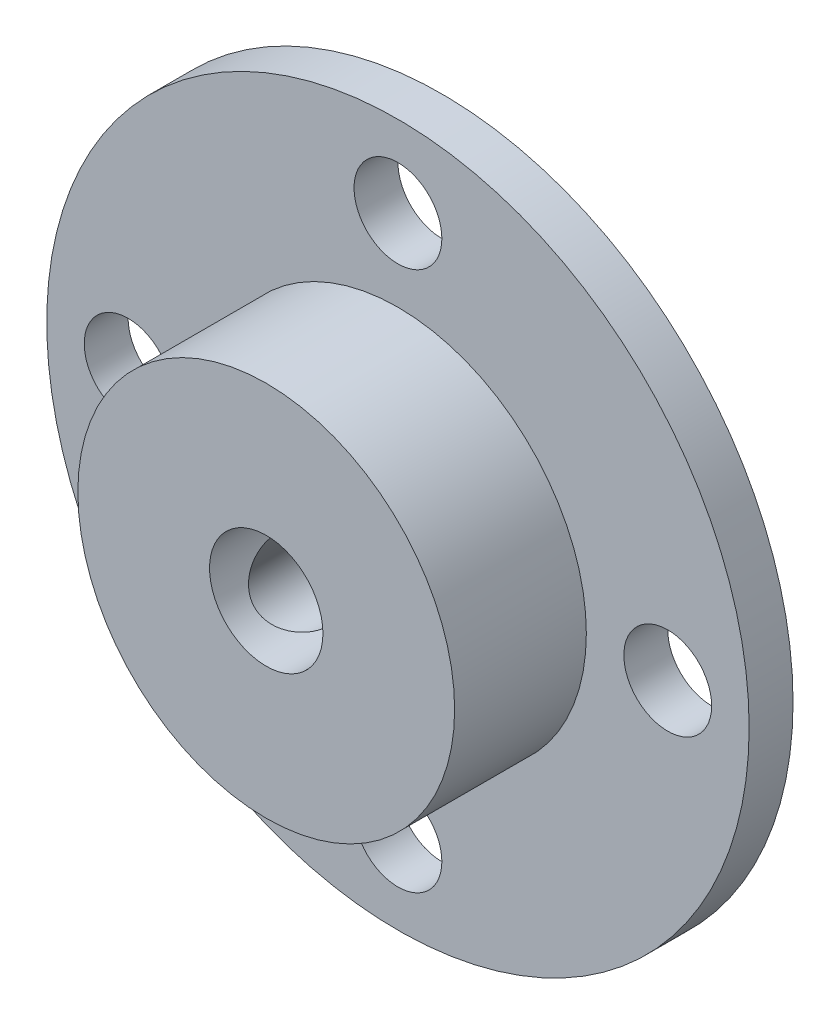
ISO-10303-21;
HEADER;
FILE_DESCRIPTION(('STEP AP214'),'2;1');
FILE_NAME('part.step','',(''),(''),'','','');
FILE_SCHEMA(('AUTOMOTIVE_DESIGN { 1 0 10303 214 1 1 1 1 }'));
ENDSEC;
DATA;
#1=APPLICATION_CONTEXT('core data for automotive mechanical design processes');
#2=APPLICATION_PROTOCOL_DEFINITION('international standard','automotive_design',2000,#1);
#3=PRODUCT_CONTEXT('',#1,'mechanical');
#4=PRODUCT('Part','Part','',(#3));
#5=PRODUCT_RELATED_PRODUCT_CATEGORY('part','',(#4));
#6=PRODUCT_DEFINITION_FORMATION('','',#4);
#7=PRODUCT_DEFINITION_CONTEXT('part definition',#1,'design');
#8=PRODUCT_DEFINITION('design','',#6,#7);
#9=PRODUCT_DEFINITION_SHAPE('','',#8);
#10=(LENGTH_UNIT() NAMED_UNIT(*) SI_UNIT(.MILLI.,.METRE.));
#11=(NAMED_UNIT(*) PLANE_ANGLE_UNIT() SI_UNIT($,.RADIAN.));
#12=(NAMED_UNIT(*) SI_UNIT($,.STERADIAN.) SOLID_ANGLE_UNIT());
#13=UNCERTAINTY_MEASURE_WITH_UNIT(LENGTH_MEASURE(1.E-05),#10,'distance_accuracy_value','');
#14=(GEOMETRIC_REPRESENTATION_CONTEXT(3) GLOBAL_UNCERTAINTY_ASSIGNED_CONTEXT((#13)) GLOBAL_UNIT_ASSIGNED_CONTEXT((#10,
#11,#12)) REPRESENTATION_CONTEXT('',''));
#15=CARTESIAN_POINT('',(0.,0.,0.));
#16=DIRECTION('',(0.,0.,1.));
#17=DIRECTION('',(1.,0.,0.));
#18=AXIS2_PLACEMENT_3D('',#15,#16,#17);
#19=CARTESIAN_POINT('',(15.304322218472,0.,9.08050000000009));
#20=DIRECTION('',(0.,0.,-1.));
#21=DIRECTION('',(-1.,0.,0.));
#22=AXIS2_PLACEMENT_3D('',#19,#20,#21);
#23=PLANE('',#22);
#24=CARTESIAN_POINT('',(15.304322218472,14.947217801772,9.08050000000009));
#25=DIRECTION('',(0.,0.,1.));
#26=DIRECTION('',(1.,0.,0.));
#27=AXIS2_PLACEMENT_3D('',#24,#25,#26);
#28=CIRCLE('',#27,1.58749999999999);
#29=CARTESIAN_POINT('',(16.891822218472,14.947217801772,9.08050000000009));
#30=VERTEX_POINT('',#29);
#31=EDGE_CURVE('E90',#30,#30,#28,.T.);
#32=ORIENTED_EDGE('',*,*,#31,.F.);
#33=EDGE_LOOP('',(#32));
#34=FACE_BOUND('',#33,.T.);
#35=CARTESIAN_POINT('',(25.060572218472,24.703467801772,9.08050000000009));
#36=DIRECTION('',(0.,0.,1.));
#37=DIRECTION('',(1.,0.,0.));
#38=AXIS2_PLACEMENT_3D('',#35,#36,#37);
#39=CIRCLE('',#38,1.58749999999999);
#40=CARTESIAN_POINT('',(26.648072218472,24.703467801772,9.08050000000009));
#41=VERTEX_POINT('',#40);
#42=EDGE_CURVE('E84',#41,#41,#39,.T.);
#43=ORIENTED_EDGE('',*,*,#42,.F.);
#44=EDGE_LOOP('',(#43));
#45=FACE_BOUND('',#44,.T.);
#46=CARTESIAN_POINT('',(15.304322218472,34.459717801772,9.08050000000009));
#47=DIRECTION('',(0.,0.,1.));
#48=DIRECTION('',(1.,0.,0.));
#49=AXIS2_PLACEMENT_3D('',#46,#47,#48);
#50=CIRCLE('',#49,1.58749999999999);
#51=CARTESIAN_POINT('',(16.891822218472,34.459717801772,9.08050000000009));
#52=VERTEX_POINT('',#51);
#53=EDGE_CURVE('E78',#52,#52,#50,.T.);
#54=ORIENTED_EDGE('',*,*,#53,.F.);
#55=EDGE_LOOP('',(#54));
#56=FACE_BOUND('',#55,.T.);
#57=CARTESIAN_POINT('',(15.304322218472,24.703467801772,9.08050000000009));
#58=DIRECTION('',(0.,0.,1.));
#59=DIRECTION('',(1.,0.,0.));
#60=AXIS2_PLACEMENT_3D('',#57,#58,#59);
#61=CIRCLE('',#60,6.81250000000001);
#62=CARTESIAN_POINT('',(22.116822218472,24.703467801772,9.08050000000009));
#63=VERTEX_POINT('',#62);
#64=EDGE_CURVE('E60',#63,#63,#61,.T.);
#65=ORIENTED_EDGE('',*,*,#64,.F.);
#66=EDGE_LOOP('',(#65));
#67=FACE_BOUND('',#66,.T.);
#68=CARTESIAN_POINT('',(15.304322218472,24.703467801772,9.08050000000009));
#69=DIRECTION('',(0.,0.,1.));
#70=DIRECTION('',(1.,0.,0.));
#71=AXIS2_PLACEMENT_3D('',#68,#69,#70);
#72=CIRCLE('',#71,12.7);
#73=CARTESIAN_POINT('',(28.004322218472,24.703467801772,9.08050000000009));
#74=VERTEX_POINT('',#73);
#75=EDGE_CURVE('E63',#74,#74,#72,.T.);
#76=ORIENTED_EDGE('',*,*,#75,.T.);
#77=EDGE_LOOP('',(#76));
#78=FACE_BOUND('',#77,.T.);
#79=CARTESIAN_POINT('',(5.54807221847201,24.703467801772,9.08050000000009));
#80=DIRECTION('',(0.,0.,1.));
#81=DIRECTION('',(1.,0.,0.));
#82=AXIS2_PLACEMENT_3D('',#79,#80,#81);
#83=CIRCLE('',#82,1.58749999999999);
#84=CARTESIAN_POINT('',(7.135572218472,24.703467801772,9.08050000000009));
#85=VERTEX_POINT('',#84);
#86=EDGE_CURVE('E72',#85,#85,#83,.T.);
#87=ORIENTED_EDGE('',*,*,#86,.F.);
#88=EDGE_LOOP('',(#87));
#89=FACE_BOUND('',#88,.T.);
#90=ADVANCED_FACE('F39',(#34,#45,#56,#67,#78,#89),#23,.F.);
#91=CARTESIAN_POINT('',(15.304322218472,0.,7.49300000000009));
#92=DIRECTION('',(0.,0.,1.));
#93=DIRECTION('',(1.,0.,0.));
#94=AXIS2_PLACEMENT_3D('',#91,#92,#93);
#95=PLANE('',#94);
#96=CARTESIAN_POINT('',(15.304322218472,14.947217801772,7.49300000000009));
#97=DIRECTION('',(0.,0.,1.));
#98=DIRECTION('',(1.,0.,0.));
#99=AXIS2_PLACEMENT_3D('',#96,#97,#98);
#100=CIRCLE('',#99,1.5875);
#101=CARTESIAN_POINT('',(16.891822218472,14.947217801772,7.49300000000009));
#102=VERTEX_POINT('',#101);
#103=EDGE_CURVE('E87',#102,#102,#100,.T.);
#104=ORIENTED_EDGE('',*,*,#103,.T.);
#105=EDGE_LOOP('',(#104));
#106=FACE_BOUND('',#105,.T.);
#107=CARTESIAN_POINT('',(25.060572218472,24.703467801772,7.49300000000009));
#108=DIRECTION('',(0.,0.,1.));
#109=DIRECTION('',(1.,0.,0.));
#110=AXIS2_PLACEMENT_3D('',#107,#108,#109);
#111=CIRCLE('',#110,1.5875);
#112=CARTESIAN_POINT('',(26.648072218472,24.703467801772,7.49300000000009));
#113=VERTEX_POINT('',#112);
#114=EDGE_CURVE('E81',#113,#113,#111,.T.);
#115=ORIENTED_EDGE('',*,*,#114,.T.);
#116=EDGE_LOOP('',(#115));
#117=FACE_BOUND('',#116,.T.);
#118=CARTESIAN_POINT('',(15.304322218472,34.459717801772,7.49300000000009));
#119=DIRECTION('',(0.,0.,1.));
#120=DIRECTION('',(1.,0.,0.));
#121=AXIS2_PLACEMENT_3D('',#118,#119,#120);
#122=CIRCLE('',#121,1.5875);
#123=CARTESIAN_POINT('',(16.891822218472,34.459717801772,7.49300000000009));
#124=VERTEX_POINT('',#123);
#125=EDGE_CURVE('E75',#124,#124,#122,.T.);
#126=ORIENTED_EDGE('',*,*,#125,.T.);
#127=EDGE_LOOP('',(#126));
#128=FACE_BOUND('',#127,.T.);
#129=CARTESIAN_POINT('',(5.54807221847201,24.703467801772,7.49300000000009));
#130=DIRECTION('',(0.,0.,1.));
#131=DIRECTION('',(1.,0.,0.));
#132=AXIS2_PLACEMENT_3D('',#129,#130,#131);
#133=CIRCLE('',#132,1.5875);
#134=CARTESIAN_POINT('',(7.13557221847201,24.703467801772,7.49300000000009));
#135=VERTEX_POINT('',#134);
#136=EDGE_CURVE('E69',#135,#135,#133,.T.);
#137=ORIENTED_EDGE('',*,*,#136,.T.);
#138=EDGE_LOOP('',(#137));
#139=FACE_BOUND('',#138,.T.);
#140=CARTESIAN_POINT('',(15.304322218472,24.703467801772,7.49300000000009));
#141=DIRECTION('',(0.,0.,1.));
#142=DIRECTION('',(1.,0.,0.));
#143=AXIS2_PLACEMENT_3D('',#140,#141,#142);
#144=CIRCLE('',#143,12.7);
#145=CARTESIAN_POINT('',(28.004322218472,24.703467801772,7.49300000000009));
#146=VERTEX_POINT('',#145);
#147=EDGE_CURVE('E66',#146,#146,#144,.T.);
#148=ORIENTED_EDGE('',*,*,#147,.F.);
#149=EDGE_LOOP('',(#148));
#150=FACE_BOUND('',#149,.T.);
#151=CARTESIAN_POINT('',(15.304322218472,24.703467801772,7.49300000000009));
#152=DIRECTION('',(0.,0.,1.));
#153=DIRECTION('',(1.,0.,0.));
#154=AXIS2_PLACEMENT_3D('',#151,#152,#153);
#155=CIRCLE('',#154,2.05);
#156=CARTESIAN_POINT('',(17.354322218472,24.703467801772,7.49300000000009));
#157=VERTEX_POINT('',#156);
#158=EDGE_CURVE('E10',#157,#157,#155,.T.);
#159=ORIENTED_EDGE('',*,*,#158,.T.);
#160=EDGE_LOOP('',(#159));
#161=FACE_BOUND('',#160,.T.);
#162=ADVANCED_FACE('F41',(#106,#117,#128,#139,#150,#161),#95,.F.);
#163=CARTESIAN_POINT('',(15.304322218472,24.703467801772,13.843));
#164=DIRECTION('',(0.,0.,1.));
#165=DIRECTION('',(1.,0.,0.));
#166=AXIS2_PLACEMENT_3D('',#163,#164,#165);
#167=CYLINDRICAL_SURFACE('',#166,2.05);
#168=CARTESIAN_POINT('',(15.1714287863492,22.6577798158614,11.46175));
#169=CARTESIAN_POINT('',(15.1714199645603,22.6577774869909,11.3955140145172));
#170=CARTESIAN_POINT('',(15.1648818997962,22.6581731530945,11.3292467675641));
#171=CARTESIAN_POINT('',(15.1396058342408,22.6600598870282,11.1990667024952));
#172=CARTESIAN_POINT('',(15.1208459232602,22.6615529227378,11.1351583309857));
#173=CARTESIAN_POINT('',(15.0734362721785,22.6663749447985,11.0119700058423));
#174=CARTESIAN_POINT('',(15.0448802410607,22.6696867074661,10.9526524980655));
#175=CARTESIAN_POINT('',(14.9799808208232,22.6790230558176,10.838729667946));
#176=CARTESIAN_POINT('',(14.9436357257995,22.6850482360932,10.7841253815395));
#177=CARTESIAN_POINT('',(14.8589640870089,22.7018962780591,10.6720885472307));
#178=CARTESIAN_POINT('',(14.8096561798401,22.7133088655971,10.6154862149188));
#179=CARTESIAN_POINT('',(14.7052471223705,22.742205430255,10.5095705609515));
#180=CARTESIAN_POINT('',(14.6501405193552,22.7596951581381,10.4602642066784));
#181=CARTESIAN_POINT('',(14.5280277077454,22.8048701846117,10.3634623122151));
#182=CARTESIAN_POINT('',(14.4604366044041,22.8336414988397,10.3171909256965));
#183=CARTESIAN_POINT('',(14.3232301576745,22.9018561669057,10.2371619056692));
#184=CARTESIAN_POINT('',(14.2536171191645,22.9412877643306,10.20339058342));
#185=CARTESIAN_POINT('',(14.1234619621062,23.0261423248724,10.1533811500106));
#186=CARTESIAN_POINT('',(14.0627670321254,23.0704228617283,10.1356187215504));
#187=CARTESIAN_POINT('',(13.9453320279352,23.1667866019915,10.1128891876442));
#188=CARTESIAN_POINT('',(13.8885872013698,23.2188601833073,10.107906438811));
#189=CARTESIAN_POINT('',(13.789546760068,23.3206318017379,10.1108378240011));
#190=CARTESIAN_POINT('',(13.7463581033761,23.3695271825575,10.116940487124));
#191=CARTESIAN_POINT('',(13.6656983961584,23.4699533467321,10.1382900493217));
#192=CARTESIAN_POINT('',(13.6282277669137,23.5214843238941,10.1535376217491));
#193=CARTESIAN_POINT('',(13.5596179744598,23.6253326367168,10.1923710761501));
#194=CARTESIAN_POINT('',(13.5284615488111,23.6776473967091,10.2159337278014));
#195=CARTESIAN_POINT('',(13.4723069383115,23.7816662895443,10.2704892760165));
#196=CARTESIAN_POINT('',(13.4473099192479,23.8333703050315,10.3014835769776));
#197=CARTESIAN_POINT('',(13.4001860059442,23.9414459512927,10.374518041243));
#198=CARTESIAN_POINT('',(13.3788582452279,23.9975472285777,10.4174714948528));
#199=CARTESIAN_POINT('',(13.3426256386925,24.1055544664628,10.510839853361));
#200=CARTESIAN_POINT('',(13.3277307960009,24.1574537919832,10.561266216213));
#201=CARTESIAN_POINT('',(13.3014537418999,24.2625903413061,10.677020517984));
#202=CARTESIAN_POINT('',(13.2909433147047,24.3148430811856,10.743448749122));
#203=CARTESIAN_POINT('',(13.2751970268864,24.4078698784059,10.88446685245));
#204=CARTESIAN_POINT('',(13.2699520669274,24.4486636499734,10.9590423969083));
#205=CARTESIAN_POINT('',(13.2637944712764,24.5051829415229,11.0930485650476));
#206=CARTESIAN_POINT('',(13.2620774203889,24.5247333238865,11.150823425438));
#207=CARTESIAN_POINT('',(13.2597245546632,24.5539970509941,11.2688024604137));
#208=CARTESIAN_POINT('',(13.2590869305586,24.5637268453038,11.3290023964536));
#209=CARTESIAN_POINT('',(13.2585156851902,24.5723271498539,11.4504350359262));
#210=CARTESIAN_POINT('',(13.2585848491961,24.5711546987906,11.5116708752027));
#211=CARTESIAN_POINT('',(13.2594813940261,24.5579859561689,11.6329806152367));
#212=CARTESIAN_POINT('',(13.2603093996507,24.545980745467,11.6930535168515));
#213=CARTESIAN_POINT('',(13.2631131413159,24.5131572108651,11.8078562427013));
#214=CARTESIAN_POINT('',(13.2650381068975,24.492739136349,11.8627047275711));
#215=CARTESIAN_POINT('',(13.2705774134969,24.4446909255356,11.9690219271715));
#216=CARTESIAN_POINT('',(13.2741923148103,24.4170583986399,12.0204895145111));
#217=CARTESIAN_POINT('',(13.2846978754065,24.3499341778983,12.1295024062228));
#218=CARTESIAN_POINT('',(13.2920974400195,24.3091766998781,12.1862175708593));
#219=CARTESIAN_POINT('',(13.3113065949368,24.2213746589363,12.2937835040207));
#220=CARTESIAN_POINT('',(13.3231215689098,24.1743224660758,12.3446270138159));
#221=CARTESIAN_POINT('',(13.3551928440865,24.0653000917903,12.4498677927526));
#222=CARTESIAN_POINT('',(13.3766949825041,24.0022642320063,12.5027985282073));
#223=CARTESIAN_POINT('',(13.4291339834291,23.8721588867453,12.59795391872));
#224=CARTESIAN_POINT('',(13.4600618519544,23.8050932951823,12.6401887097546));
#225=CARTESIAN_POINT('',(13.5252718514823,23.6830299702917,12.7051210394376));
#226=CARTESIAN_POINT('',(13.5577243546258,23.628228730079,12.7300222677718));
#227=CARTESIAN_POINT('',(13.6294057440201,23.5196717583994,12.770663610797));
#228=CARTESIAN_POINT('',(13.6686289221308,23.4659151883389,12.7864113940146));
#229=CARTESIAN_POINT('',(13.7534604838814,23.3611236954304,12.8079590471889));
#230=CARTESIAN_POINT('',(13.7990944221165,23.310100853029,12.8137178084865));
#231=CARTESIAN_POINT('',(13.8953337513597,23.2128542426142,12.814797701582));
#232=CARTESIAN_POINT('',(13.9459389234631,23.1666302634707,12.8101192927764));
#233=CARTESIAN_POINT('',(14.0467934420968,23.0832460282611,12.7912839649766));
#234=CARTESIAN_POINT('',(14.0968387170379,23.0456856702497,12.7777842786922));
#235=CARTESIAN_POINT('',(14.1981020271379,22.9764640873092,12.7426287967657));
#236=CARTESIAN_POINT('',(14.2493202454708,22.9448037909219,12.7209717189446));
#237=CARTESIAN_POINT('',(14.3546577167087,22.8856354651859,12.6687514786015));
#238=CARTESIAN_POINT('',(14.4087567562866,22.858513985069,12.6377137236574));
#239=CARTESIAN_POINT('',(14.5150573442606,22.8105951450694,12.5683658363955));
#240=CARTESIAN_POINT('',(14.5672576372529,22.7898019046663,12.5300509931679));
#241=CARTESIAN_POINT('',(14.6762856902745,22.7510544559224,12.4404519428036));
#242=CARTESIAN_POINT('',(14.7325565905001,22.7340558682372,12.3880762357891));
#243=CARTESIAN_POINT('',(14.8385524523927,22.7063295582639,12.2755393392936));
#244=CARTESIAN_POINT('',(14.8882731753749,22.6956058812378,12.2153731579604));
#245=CARTESIAN_POINT('',(14.9742682022329,22.6797854582435,12.0939672845106));
#246=CARTESIAN_POINT('',(15.0113718880622,22.6742503042373,12.0333747762446));
#247=CARTESIAN_POINT('',(15.0756136646672,22.6660070501762,11.90697572615));
#248=CARTESIAN_POINT('',(15.102773059531,22.6632928833707,11.841180702259));
#249=CARTESIAN_POINT('',(15.1391337696063,22.6600742994613,11.7229967143598));
#250=CARTESIAN_POINT('',(15.1511520432815,22.659182141337,11.6714857826606));
#251=CARTESIAN_POINT('',(15.167300975507,22.6580359960182,11.5672394018041));
#252=CARTESIAN_POINT('',(15.1714358125916,22.6577816707243,11.51450461635));
#253=CARTESIAN_POINT('',(15.1714287863492,22.6577798158614,11.46175));
#254=B_SPLINE_CURVE_WITH_KNOTS('',3,(#168,#169,#170,#171,#172,#173,#174,#175,#176,#177,#178,
#179,#180,#181,#182,#183,#184,#185,#186,#187,#188,#189,#190,#191,#192,#193,#194,#195,#196,#197,
#198,#199,#200,#201,#202,#203,#204,#205,#206,#207,#208,#209,#210,#211,#212,#213,#214,#215,#216,
#217,#218,#219,#220,#221,#222,#223,#224,#225,#226,#227,#228,#229,#230,#231,#232,#233,#234,#235,
#236,#237,#238,#239,#240,#241,#242,#243,#244,#245,#246,#247,#248,#249,#250,#251,#252,#253),
.UNSPECIFIED.,.T.,.F.,(4,2,2,2,2,2,2,2,2,2,2,2,2,2,2,2,2,2,2,2,2,2,2,2,2,2,2,2,2,2,2,2,2,2,2,2,
2,2,2,2,2,2,4),(0.,0.19846766116353,0.39729209938491,0.594265314346897,0.791281713115574,
1.018223621449,1.24538087111949,1.50440168720251,1.76313800609326,1.99330313113167,
2.22318638021833,2.41880781196,2.61444364934988,2.8095371989191,3.00466764542153,
3.22523927669499,3.44615267058604,3.70047249061342,3.95435205612267,4.13667452357897,
4.31869109005059,4.50142521261421,4.68430992658484,4.85934754268071,5.03444323343903,
5.24440043184624,5.45461446886369,5.7086248931973,5.96239369697868,6.16668557686919,
6.37080605854312,6.57576459879228,6.78071411788431,6.97190826819848,7.16313248296466,
7.36638729862527,7.56977414498105,7.80503537530612,8.04044810543744,8.25345523527086,
8.46600332298344,8.62415963780598,8.78223210017279),.UNSPECIFIED.);
#255=CARTESIAN_POINT('',(15.1714287863492,22.6577798158614,11.46175));
#256=VERTEX_POINT('',#255);
#257=EDGE_CURVE('E43',#256,#256,#254,.T.);
#258=ORIENTED_EDGE('',*,*,#257,.F.);
#259=EDGE_LOOP('',(#258));
#260=FACE_BOUND('',#259,.T.);
#261=CARTESIAN_POINT('',(15.304322218472,24.703467801772,13.843));
#262=DIRECTION('',(0.,0.,1.));
#263=DIRECTION('',(1.,0.,0.));
#264=AXIS2_PLACEMENT_3D('',#261,#262,#263);
#265=CIRCLE('',#264,2.05);
#266=CARTESIAN_POINT('',(17.354322218472,24.703467801772,13.843));
#267=VERTEX_POINT('',#266);
#268=EDGE_CURVE('E51',#267,#267,#265,.T.);
#269=ORIENTED_EDGE('',*,*,#268,.T.);
#270=EDGE_LOOP('',(#269));
#271=FACE_BOUND('',#270,.T.);
#272=ORIENTED_EDGE('',*,*,#158,.F.);
#273=EDGE_LOOP('',(#272));
#274=FACE_BOUND('',#273,.T.);
#275=ADVANCED_FACE('F133',(#260,#271,#274),#167,.F.);
#276=CARTESIAN_POINT('',(15.304322218472,0.,13.843));
#277=DIRECTION('',(0.,0.,-1.));
#278=DIRECTION('',(-1.,0.,0.));
#279=AXIS2_PLACEMENT_3D('',#276,#277,#278);
#280=PLANE('',#279);
#281=ORIENTED_EDGE('',*,*,#268,.F.);
#282=EDGE_LOOP('',(#281));
#283=FACE_BOUND('',#282,.T.);
#284=CARTESIAN_POINT('',(15.304322218472,24.703467801772,13.843));
#285=DIRECTION('',(0.,0.,1.));
#286=DIRECTION('',(1.,0.,0.));
#287=AXIS2_PLACEMENT_3D('',#284,#285,#286);
#288=CIRCLE('',#287,6.81250000000001);
#289=CARTESIAN_POINT('',(22.116822218472,24.703467801772,13.843));
#290=VERTEX_POINT('',#289);
#291=EDGE_CURVE('E55',#290,#290,#288,.T.);
#292=ORIENTED_EDGE('',*,*,#291,.T.);
#293=EDGE_LOOP('',(#292));
#294=FACE_BOUND('',#293,.T.);
#295=ADVANCED_FACE('F152',(#283,#294),#280,.F.);
#296=CARTESIAN_POINT('',(15.304322218472,24.703467801772,13.843));
#297=DIRECTION('',(0.,0.,1.));
#298=DIRECTION('',(1.,0.,0.));
#299=AXIS2_PLACEMENT_3D('',#296,#297,#298);
#300=CYLINDRICAL_SURFACE('',#299,6.81250000000001);
#301=CARTESIAN_POINT('',(11.5394503467417,19.025801376254,11.46175));
#302=CARTESIAN_POINT('',(11.5394473185518,19.0258022963991,11.3865844068538));
#303=CARTESIAN_POINT('',(11.5340974460231,19.0293397378433,11.3113835245234));
#304=CARTESIAN_POINT('',(11.5129329798188,19.0434607625149,11.1631083166937));
#305=CARTESIAN_POINT('',(11.4971099523533,19.0540500244525,11.0900357546327));
#306=CARTESIAN_POINT('',(11.4557321285993,19.0821573286808,10.9481838342344));
#307=CARTESIAN_POINT('',(11.4301869383335,19.0996685323761,10.8794003159149));
#308=CARTESIAN_POINT('',(11.3704525761701,19.1414404500607,10.7479196310792));
#309=CARTESIAN_POINT('',(11.3362639096429,19.1657007694481,10.6852221090211));
#310=CARTESIAN_POINT('',(11.2601200292058,19.2210575714169,10.5668158833967));
#311=CARTESIAN_POINT('',(11.2180730676797,19.2522357223515,10.5112043461474));
#312=CARTESIAN_POINT('',(11.1280959329756,19.3208582418434,10.4093967709961));
#313=CARTESIAN_POINT('',(11.0801653509748,19.3583030459043,10.3632013879687));
#314=CARTESIAN_POINT('',(10.9797146084816,19.4392380838623,10.2811609627612));
#315=CARTESIAN_POINT('',(10.9271585835079,19.4827774516127,10.2454081697664));
#316=CARTESIAN_POINT('',(10.819668854331,19.5748188263087,10.1858629735031));
#317=CARTESIAN_POINT('',(10.7647353699358,19.6233203750391,10.1620694670937));
#318=CARTESIAN_POINT('',(10.655069655008,19.723503088888,10.1274204873493));
#319=CARTESIAN_POINT('',(10.6003440790509,19.7751347688734,10.116400970099));
#320=CARTESIAN_POINT('',(10.4921102736861,19.8807623627053,10.1071010433108));
#321=CARTESIAN_POINT('',(10.4386019290942,19.9347580514243,10.1088194233394));
#322=CARTESIAN_POINT('',(10.3350812273076,20.0427468890754,10.1248219246628));
#323=CARTESIAN_POINT('',(10.2850303448992,20.0967294381464,10.1389293525428));
#324=CARTESIAN_POINT('',(10.1888539586793,20.2037654754203,10.1790293272638));
#325=CARTESIAN_POINT('',(10.1427286103863,20.2568189267487,10.2050223447189));
#326=CARTESIAN_POINT('',(10.0551051336301,20.3605975799375,10.2683199028555));
#327=CARTESIAN_POINT('',(10.0136375904642,20.4113062363437,10.3056938367246));
#328=CARTESIAN_POINT('',(9.93638490352406,20.508321002359,10.3906409958362));
#329=CARTESIAN_POINT('',(9.90060040534107,20.5546266115447,10.4382153784044));
#330=CARTESIAN_POINT('',(9.83466298514698,20.6419368520022,10.5431828168706));
#331=CARTESIAN_POINT('',(9.8046173641969,20.6828367566108,10.6007305024064));
#332=CARTESIAN_POINT('',(9.75130454472971,20.7567937992976,10.7234991965261));
#333=CARTESIAN_POINT('',(9.72803747071949,20.7898507933168,10.7887203460237));
#334=CARTESIAN_POINT('',(9.68849358514529,20.8468066237487,10.9251979156615));
#335=CARTESIAN_POINT('',(9.67223144427483,20.8706862284527,10.9964666316214));
#336=CARTESIAN_POINT('',(9.64694134874401,20.9081136255437,11.1428932375894));
#337=CARTESIAN_POINT('',(9.63791246617348,20.9216627431544,11.2180506274261));
#338=CARTESIAN_POINT('',(9.62727170991614,20.9376550706237,11.3687631221788));
#339=CARTESIAN_POINT('',(9.6255373042373,20.9402817461403,11.4442901377136));
#340=CARTESIAN_POINT('',(9.6291671206785,20.9348100445299,11.5947794615247));
#341=CARTESIAN_POINT('',(9.63453094649933,20.9267122661565,11.6697418010923));
#342=CARTESIAN_POINT('',(9.65221686492891,20.9002970909013,11.816248494049));
#343=CARTESIAN_POINT('',(9.6644728864165,20.882076752333,11.887818406694));
#344=CARTESIAN_POINT('',(9.69577307918782,20.8362857172513,12.0263317807406));
#345=CARTESIAN_POINT('',(9.71481780270935,20.8087142600652,12.0932748652364));
#346=CARTESIAN_POINT('',(9.75979261665631,20.7449474021062,12.2215818780703));
#347=CARTESIAN_POINT('',(9.78580808050797,20.7086456853711,12.2828630134473));
#348=CARTESIAN_POINT('',(9.84432027767159,20.629039041582,12.3972399587489));
#349=CARTESIAN_POINT('',(9.87681766791542,20.5857334047773,12.4503349380532));
#350=CARTESIAN_POINT('',(9.94841439762256,20.4930185313706,12.5476513301639));
#351=CARTESIAN_POINT('',(9.98760607447654,20.4435269553094,12.591726538385));
#352=CARTESIAN_POINT('',(10.0716008311372,20.3407644612856,12.6687158473184));
#353=CARTESIAN_POINT('',(10.116403677411,20.2874937006501,12.7016304123173));
#354=CARTESIAN_POINT('',(10.2104537804521,20.1793366609733,12.7551503193872));
#355=CARTESIAN_POINT('',(10.2596742351308,20.1244613271224,12.7758247866754));
#356=CARTESIAN_POINT('',(10.3615927137683,20.0146311663515,12.8044968388426));
#357=CARTESIAN_POINT('',(10.4142903244933,19.9596763496341,12.8124959272785));
#358=CARTESIAN_POINT('',(10.5207790742446,19.8523349379445,12.8155326311128));
#359=CARTESIAN_POINT('',(10.5745359605834,19.7999204616238,12.8107901792317));
#360=CARTESIAN_POINT('',(10.6824039308471,19.698117771697,12.788963562111));
#361=CARTESIAN_POINT('',(10.7365150104426,19.6487295211778,12.7718795474441));
#362=CARTESIAN_POINT('',(10.8432611444763,19.5542773022395,12.7259519087012));
#363=CARTESIAN_POINT('',(10.8958991960024,19.5092040205109,12.6971343506433));
#364=CARTESIAN_POINT('',(10.9981018275026,19.4241641306732,12.6285852735464));
#365=CARTESIAN_POINT('',(11.0476661685666,19.3841979192657,12.5888529074328));
#366=CARTESIAN_POINT('',(11.1427887670329,19.3094416651331,12.4988583691738));
#367=CARTESIAN_POINT('',(11.188270706714,19.2747441320149,12.4484386674414));
#368=CARTESIAN_POINT('',(11.2726653084046,19.2117760730038,12.3388247351683));
#369=CARTESIAN_POINT('',(11.3115764135708,19.1835070696893,12.2796284313882));
#370=CARTESIAN_POINT('',(11.3816726914256,19.1334717232659,12.1533901603677));
#371=CARTESIAN_POINT('',(11.4127717220343,19.1117773809596,12.086271776645));
#372=CARTESIAN_POINT('',(11.4653484616101,19.0755495041004,11.946602291444));
#373=CARTESIAN_POINT('',(11.4868349404105,19.061009441259,11.8740562126586));
#374=CARTESIAN_POINT('',(11.5150718259657,19.0420243419294,11.7447415727132));
#375=CARTESIAN_POINT('',(11.5241907890477,19.0359448524116,11.6887129724816));
#376=CARTESIAN_POINT('',(11.5363810960143,19.0278330886197,11.5757129894969));
#377=CARTESIAN_POINT('',(11.539452642759,19.0258006785866,11.5187416384329));
#378=CARTESIAN_POINT('',(11.5394503467417,19.025801376254,11.46175));
#379=B_SPLINE_CURVE_WITH_KNOTS('',3,(#301,#302,#303,#304,#305,#306,#307,#308,#309,#310,#311,
#312,#313,#314,#315,#316,#317,#318,#319,#320,#321,#322,#323,#324,#325,#326,#327,#328,#329,#330,
#331,#332,#333,#334,#335,#336,#337,#338,#339,#340,#341,#342,#343,#344,#345,#346,#347,#348,#349,
#350,#351,#352,#353,#354,#355,#356,#357,#358,#359,#360,#361,#362,#363,#364,#365,#366,#367,#368,
#369,#370,#371,#372,#373,#374,#375,#376,#377,#378),.UNSPECIFIED.,.T.,.F.,(4,2,2,2,2,2,2,2,2,2,2,
2,2,2,2,2,2,2,2,2,2,2,2,2,2,2,2,2,2,2,2,2,2,2,2,2,2,2,4),(0.,0.225288119692965,
0.450757879784262,0.676005439493912,0.901239832378901,1.12928990783015,1.35735583830199,
1.58737944476993,1.81738182965102,2.04439659959624,2.27138979747501,2.49519724033905,
2.71901354570501,2.94422282649717,3.1694576726856,3.3985616826366,3.62766990045526,
3.85725564239699,4.08681192747934,4.31249635185417,4.53816817664211,4.76171262939159,
4.98527527087229,5.21171213151317,5.43817195280373,5.66805364184854,5.89792576656175,
6.12648700298947,6.35502112539093,6.57963595658636,6.80424804742641,7.02836386243098,
7.25249707549491,7.48019764502492,7.70795208872463,7.93811740372654,8.16807230129636,
8.33889473808413,8.50971144454948),.UNSPECIFIED.);
#380=CARTESIAN_POINT('',(11.5394503467417,19.025801376254,11.46175));
#381=VERTEX_POINT('',#380);
#382=EDGE_CURVE('E93',#381,#381,#379,.T.);
#383=ORIENTED_EDGE('',*,*,#382,.T.);
#384=EDGE_LOOP('',(#383));
#385=FACE_BOUND('',#384,.T.);
#386=ORIENTED_EDGE('',*,*,#291,.F.);
#387=EDGE_LOOP('',(#386));
#388=FACE_BOUND('',#387,.T.);
#389=ORIENTED_EDGE('',*,*,#64,.T.);
#390=EDGE_LOOP('',(#389));
#391=FACE_BOUND('',#390,.T.);
#392=ADVANCED_FACE('F99',(#385,#388,#391),#300,.T.);
#393=CARTESIAN_POINT('',(15.304322218472,24.703467801772,13.843));
#394=DIRECTION('',(0.,0.,1.));
#395=DIRECTION('',(1.,0.,0.));
#396=AXIS2_PLACEMENT_3D('',#393,#394,#395);
#397=CYLINDRICAL_SURFACE('',#396,12.7);
#398=ORIENTED_EDGE('',*,*,#75,.F.);
#399=EDGE_LOOP('',(#398));
#400=FACE_BOUND('',#399,.T.);
#401=ORIENTED_EDGE('',*,*,#147,.T.);
#402=EDGE_LOOP('',(#401));
#403=FACE_BOUND('',#402,.T.);
#404=ADVANCED_FACE('F124',(#400,#403),#397,.T.);
#405=CARTESIAN_POINT('',(5.54807221847201,24.703467801772,9.08050000000009));
#406=DIRECTION('',(0.,0.,1.));
#407=DIRECTION('',(1.,0.,0.));
#408=AXIS2_PLACEMENT_3D('',#405,#406,#407);
#409=CYLINDRICAL_SURFACE('',#408,1.58749999999999);
#410=ORIENTED_EDGE('',*,*,#136,.F.);
#411=EDGE_LOOP('',(#410));
#412=FACE_BOUND('',#411,.T.);
#413=ORIENTED_EDGE('',*,*,#86,.T.);
#414=EDGE_LOOP('',(#413));
#415=FACE_BOUND('',#414,.T.);
#416=ADVANCED_FACE('F120',(#412,#415),#409,.F.);
#417=CARTESIAN_POINT('',(15.304322218472,34.459717801772,9.08050000000009));
#418=DIRECTION('',(0.,0.,1.));
#419=DIRECTION('',(1.,0.,0.));
#420=AXIS2_PLACEMENT_3D('',#417,#418,#419);
#421=CYLINDRICAL_SURFACE('',#420,1.58749999999999);
#422=ORIENTED_EDGE('',*,*,#125,.F.);
#423=EDGE_LOOP('',(#422));
#424=FACE_BOUND('',#423,.T.);
#425=ORIENTED_EDGE('',*,*,#53,.T.);
#426=EDGE_LOOP('',(#425));
#427=FACE_BOUND('',#426,.T.);
#428=ADVANCED_FACE('F116',(#424,#427),#421,.F.);
#429=CARTESIAN_POINT('',(25.060572218472,24.703467801772,9.08050000000009));
#430=DIRECTION('',(0.,0.,1.));
#431=DIRECTION('',(1.,0.,0.));
#432=AXIS2_PLACEMENT_3D('',#429,#430,#431);
#433=CYLINDRICAL_SURFACE('',#432,1.58749999999999);
#434=ORIENTED_EDGE('',*,*,#114,.F.);
#435=EDGE_LOOP('',(#434));
#436=FACE_BOUND('',#435,.T.);
#437=ORIENTED_EDGE('',*,*,#42,.T.);
#438=EDGE_LOOP('',(#437));
#439=FACE_BOUND('',#438,.T.);
#440=ADVANCED_FACE('F112',(#436,#439),#433,.F.);
#441=CARTESIAN_POINT('',(15.304322218472,14.947217801772,9.08050000000009));
#442=DIRECTION('',(0.,0.,1.));
#443=DIRECTION('',(1.,0.,0.));
#444=AXIS2_PLACEMENT_3D('',#441,#442,#443);
#445=CYLINDRICAL_SURFACE('',#444,1.58749999999999);
#446=ORIENTED_EDGE('',*,*,#103,.F.);
#447=EDGE_LOOP('',(#446));
#448=FACE_BOUND('',#447,.T.);
#449=ORIENTED_EDGE('',*,*,#31,.T.);
#450=EDGE_LOOP('',(#449));
#451=FACE_BOUND('',#450,.T.);
#452=ADVANCED_FACE('F107',(#448,#451),#445,.F.);
#453=CARTESIAN_POINT('',(10.4871572716386,19.8863028549386,11.46175));
#454=DIRECTION('',(-0.707106781186549,-0.707106781186546,0.));
#455=DIRECTION('',(0.707106781186546,-0.707106781186549,0.));
#456=AXIS2_PLACEMENT_3D('',#453,#454,#455);
#457=CYLINDRICAL_SURFACE('',#456,1.35254999999999);
#458=ORIENTED_EDGE('',*,*,#257,.T.);
#459=EDGE_LOOP('',(#458));
#460=FACE_BOUND('',#459,.T.);
#461=ORIENTED_EDGE('',*,*,#382,.F.);
#462=EDGE_LOOP('',(#461));
#463=FACE_BOUND('',#462,.T.);
#464=ADVANCED_FACE('F103',(#460,#463),#457,.F.);
#465=CLOSED_SHELL('',(#90,#162,#275,#295,#392,#404,#416,#428,#440,#452,#464));
#466=MANIFOLD_SOLID_BREP('B2',#465);
#467=ADVANCED_BREP_SHAPE_REPRESENTATION('',(#18,#466),#14);
#468=SHAPE_DEFINITION_REPRESENTATION(#9,#467);
ENDSEC;
END-ISO-10303-21;
